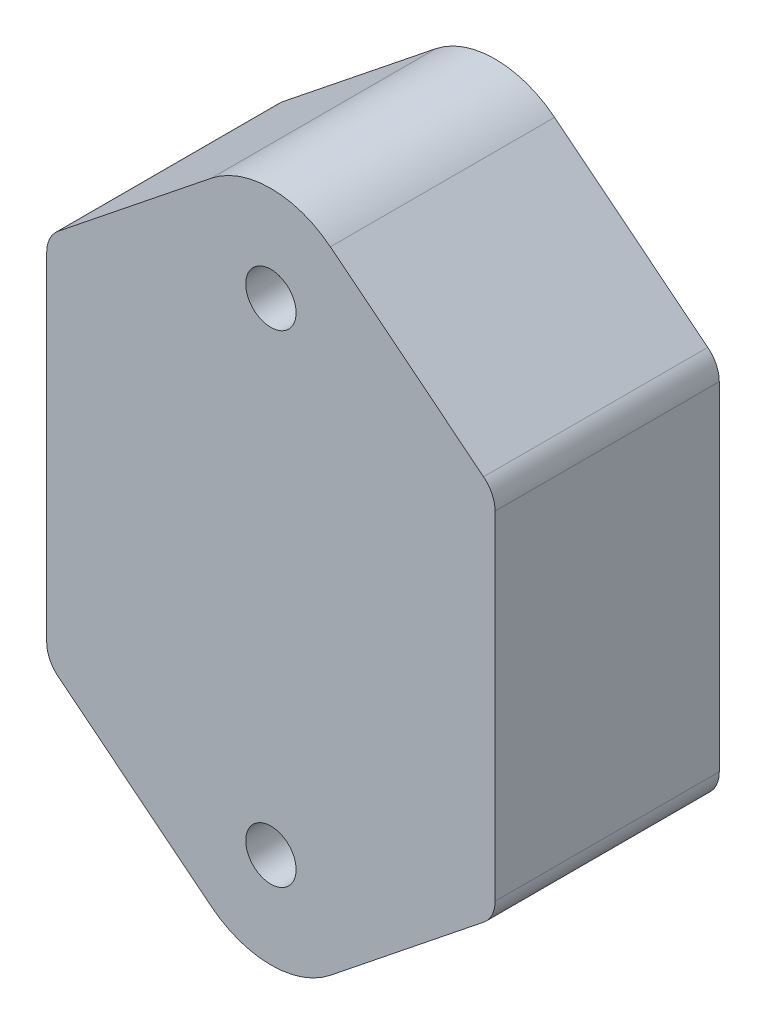
ISO-10303-21;
HEADER;
FILE_DESCRIPTION(('STEP AP214'),'2;1');
FILE_NAME('part.step','',(''),(''),'','','');
FILE_SCHEMA(('AUTOMOTIVE_DESIGN { 1 0 10303 214 1 1 1 1 }'));
ENDSEC;
DATA;
#1=APPLICATION_CONTEXT('core data for automotive mechanical design processes');
#2=APPLICATION_PROTOCOL_DEFINITION('international standard','automotive_design',2000,#1);
#3=PRODUCT_CONTEXT('',#1,'mechanical');
#4=PRODUCT('Part','Part','',(#3));
#5=PRODUCT_RELATED_PRODUCT_CATEGORY('part','',(#4));
#6=PRODUCT_DEFINITION_FORMATION('','',#4);
#7=PRODUCT_DEFINITION_CONTEXT('part definition',#1,'design');
#8=PRODUCT_DEFINITION('design','',#6,#7);
#9=PRODUCT_DEFINITION_SHAPE('','',#8);
#10=(LENGTH_UNIT() NAMED_UNIT(*) SI_UNIT(.MILLI.,.METRE.));
#11=(NAMED_UNIT(*) PLANE_ANGLE_UNIT() SI_UNIT($,.RADIAN.));
#12=(NAMED_UNIT(*) SI_UNIT($,.STERADIAN.) SOLID_ANGLE_UNIT());
#13=UNCERTAINTY_MEASURE_WITH_UNIT(LENGTH_MEASURE(1.E-05),#10,'distance_accuracy_value','');
#14=(GEOMETRIC_REPRESENTATION_CONTEXT(3) GLOBAL_UNCERTAINTY_ASSIGNED_CONTEXT((#13)) GLOBAL_UNIT_ASSIGNED_CONTEXT((#10,
#11,#12)) REPRESENTATION_CONTEXT('',''));
#15=CARTESIAN_POINT('',(0.,0.,0.));
#16=DIRECTION('',(0.,0.,1.));
#17=DIRECTION('',(1.,0.,0.));
#18=AXIS2_PLACEMENT_3D('',#15,#16,#17);
#19=CARTESIAN_POINT('',(16.002,33.909,18.542));
#20=DIRECTION('',(0.,0.,-1.));
#21=DIRECTION('',(-1.,0.,0.));
#22=AXIS2_PLACEMENT_3D('',#19,#20,#21);
#23=PLANE('',#22);
#24=CARTESIAN_POINT('',(16.002,33.909,18.542));
#25=DIRECTION('',(0.,0.,1.));
#26=DIRECTION('',(-1.,0.,0.));
#27=AXIS2_PLACEMENT_3D('',#24,#25,#26);
#28=CIRCLE('',#27,7.874);
#29=CARTESIAN_POINT('',(20.9203317887087,40.0579745824957,18.542));
#30=VERTEX_POINT('',#29);
#31=CARTESIAN_POINT('',(11.0836682112913,40.0579745824957,18.542));
#32=VERTEX_POINT('',#31);
#33=EDGE_CURVE('E176',#30,#32,#28,.T.);
#34=ORIENTED_EDGE('',*,*,#33,.T.);
#35=DIRECTION('',(-0.780921333819615,-0.624629386424777,0.));
#36=VECTOR('',#35,1.);
#37=CARTESIAN_POINT('',(-1.58655864151893,29.9235401879018,18.542));
#38=LINE('',#37,#36);
#39=CARTESIAN_POINT('',(-1.58655864151893,29.9235401879018,18.542));
#40=VERTEX_POINT('',#39);
#41=EDGE_CURVE('E104',#32,#40,#38,.T.);
#42=ORIENTED_EDGE('',*,*,#41,.T.);
#43=CARTESIAN_POINT('',(0.,27.94,18.542));
#44=DIRECTION('',(0.,0.,1.));
#45=DIRECTION('',(-1.,0.,0.));
#46=AXIS2_PLACEMENT_3D('',#43,#44,#45);
#47=CIRCLE('',#46,2.54);
#48=CARTESIAN_POINT('',(-2.54,27.94,18.542));
#49=VERTEX_POINT('',#48);
#50=EDGE_CURVE('E203',#40,#49,#47,.T.);
#51=ORIENTED_EDGE('',*,*,#50,.T.);
#52=DIRECTION('',(0.,-1.,0.));
#53=VECTOR('',#52,1.);
#54=CARTESIAN_POINT('',(-2.54,0.,18.542));
#55=LINE('',#54,#53);
#56=CARTESIAN_POINT('',(-2.54,0.,18.542));
#57=VERTEX_POINT('',#56);
#58=EDGE_CURVE('E222',#49,#57,#55,.T.);
#59=ORIENTED_EDGE('',*,*,#58,.T.);
#60=CARTESIAN_POINT('',(0.,0.,18.542));
#61=DIRECTION('',(0.,0.,1.));
#62=DIRECTION('',(1.,0.,0.));
#63=AXIS2_PLACEMENT_3D('',#60,#61,#62);
#64=CIRCLE('',#63,2.54);
#65=CARTESIAN_POINT('',(-1.58655864151893,-1.98354018790182,18.542));
#66=VERTEX_POINT('',#65);
#67=EDGE_CURVE('E219',#57,#66,#64,.T.);
#68=ORIENTED_EDGE('',*,*,#67,.T.);
#69=DIRECTION('',(0.780921333819615,-0.624629386424777,0.));
#70=VECTOR('',#69,1.);
#71=CARTESIAN_POINT('',(11.0836682112913,-12.1179745824956,18.542));
#72=LINE('',#71,#70);
#73=CARTESIAN_POINT('',(11.0836682112913,-12.1179745824956,18.542));
#74=VERTEX_POINT('',#73);
#75=EDGE_CURVE('E221',#66,#74,#72,.T.);
#76=ORIENTED_EDGE('',*,*,#75,.T.);
#77=CARTESIAN_POINT('',(16.002,-5.969,18.542));
#78=DIRECTION('',(0.,0.,1.));
#79=DIRECTION('',(-1.,0.,0.));
#80=AXIS2_PLACEMENT_3D('',#77,#78,#79);
#81=CIRCLE('',#80,7.874);
#82=CARTESIAN_POINT('',(20.9203317887087,-12.1179745824956,18.542));
#83=VERTEX_POINT('',#82);
#84=EDGE_CURVE('E224',#74,#83,#81,.T.);
#85=ORIENTED_EDGE('',*,*,#84,.T.);
#86=DIRECTION('',(0.780921333819615,0.624629386424777,0.));
#87=VECTOR('',#86,1.);
#88=CARTESIAN_POINT('',(33.5905586415189,-1.98354018790182,18.542));
#89=LINE('',#88,#87);
#90=CARTESIAN_POINT('',(33.5905586415189,-1.98354018790182,18.542));
#91=VERTEX_POINT('',#90);
#92=EDGE_CURVE('E230',#83,#91,#89,.T.);
#93=ORIENTED_EDGE('',*,*,#92,.T.);
#94=CARTESIAN_POINT('',(32.004,0.,18.542));
#95=DIRECTION('',(0.,0.,1.));
#96=DIRECTION('',(-1.,0.,0.));
#97=AXIS2_PLACEMENT_3D('',#94,#95,#96);
#98=CIRCLE('',#97,2.54);
#99=CARTESIAN_POINT('',(34.544,0.,18.542));
#100=VERTEX_POINT('',#99);
#101=EDGE_CURVE('E135',#91,#100,#98,.T.);
#102=ORIENTED_EDGE('',*,*,#101,.T.);
#103=DIRECTION('',(0.,1.,0.));
#104=VECTOR('',#103,1.);
#105=CARTESIAN_POINT('',(34.544,27.94,18.542));
#106=LINE('',#105,#104);
#107=CARTESIAN_POINT('',(34.544,27.94,18.542));
#108=VERTEX_POINT('',#107);
#109=EDGE_CURVE('E129',#100,#108,#106,.T.);
#110=ORIENTED_EDGE('',*,*,#109,.T.);
#111=CARTESIAN_POINT('',(32.004,27.94,18.542));
#112=DIRECTION('',(0.,0.,1.));
#113=DIRECTION('',(-1.,0.,0.));
#114=AXIS2_PLACEMENT_3D('',#111,#112,#113);
#115=CIRCLE('',#114,2.54);
#116=CARTESIAN_POINT('',(33.5905586415189,29.9235401879018,18.542));
#117=VERTEX_POINT('',#116);
#118=EDGE_CURVE('E133',#108,#117,#115,.T.);
#119=ORIENTED_EDGE('',*,*,#118,.T.);
#120=DIRECTION('',(-0.780921333819615,0.624629386424777,0.));
#121=VECTOR('',#120,1.);
#122=CARTESIAN_POINT('',(20.9203317887087,40.0579745824957,18.542));
#123=LINE('',#122,#121);
#124=EDGE_CURVE('E49',#117,#30,#123,.T.);
#125=ORIENTED_EDGE('',*,*,#124,.T.);
#126=EDGE_LOOP('',(#34,#42,#51,#59,#68,#76,#85,#93,#102,#110,#119,#125));
#127=FACE_BOUND('',#126,.T.);
#128=CARTESIAN_POINT('',(16.002,33.909,18.542));
#129=DIRECTION('',(0.,0.,1.));
#130=DIRECTION('',(1.,0.,0.));
#131=AXIS2_PLACEMENT_3D('',#128,#129,#130);
#132=CIRCLE('',#131,2.0828);
#133=CARTESIAN_POINT('',(18.0848,33.909,18.542));
#134=VERTEX_POINT('',#133);
#135=EDGE_CURVE('E157',#134,#134,#132,.T.);
#136=ORIENTED_EDGE('',*,*,#135,.F.);
#137=EDGE_LOOP('',(#136));
#138=FACE_BOUND('',#137,.T.);
#139=CARTESIAN_POINT('',(16.002,-5.969,18.542));
#140=DIRECTION('',(0.,0.,1.));
#141=DIRECTION('',(1.,0.,0.));
#142=AXIS2_PLACEMENT_3D('',#139,#140,#141);
#143=CIRCLE('',#142,2.0828);
#144=CARTESIAN_POINT('',(18.0848,-5.969,18.542));
#145=VERTEX_POINT('',#144);
#146=EDGE_CURVE('E271',#145,#145,#143,.T.);
#147=ORIENTED_EDGE('',*,*,#146,.F.);
#148=EDGE_LOOP('',(#147));
#149=FACE_BOUND('',#148,.T.);
#150=ADVANCED_FACE('F32',(#127,#138,#149),#23,.F.);
#151=CARTESIAN_POINT('',(16.002,33.909,0.));
#152=DIRECTION('',(0.,0.,-1.));
#153=DIRECTION('',(-1.,0.,0.));
#154=AXIS2_PLACEMENT_3D('',#151,#152,#153);
#155=PLANE('',#154);
#156=CARTESIAN_POINT('',(16.002,33.909,0.));
#157=DIRECTION('',(0.,0.,1.));
#158=DIRECTION('',(1.,0.,0.));
#159=AXIS2_PLACEMENT_3D('',#156,#157,#158);
#160=CIRCLE('',#159,2.0828);
#161=CARTESIAN_POINT('',(18.0848,33.909,0.));
#162=VERTEX_POINT('',#161);
#163=EDGE_CURVE('E276',#162,#162,#160,.T.);
#164=ORIENTED_EDGE('',*,*,#163,.T.);
#165=EDGE_LOOP('',(#164));
#166=FACE_BOUND('',#165,.T.);
#167=CARTESIAN_POINT('',(16.002,33.909,0.));
#168=DIRECTION('',(0.,0.,1.));
#169=DIRECTION('',(-1.,0.,0.));
#170=AXIS2_PLACEMENT_3D('',#167,#168,#169);
#171=CIRCLE('',#170,7.874);
#172=CARTESIAN_POINT('',(20.9203317887087,40.0579745824957,0.));
#173=VERTEX_POINT('',#172);
#174=CARTESIAN_POINT('',(11.0836682112913,40.0579745824957,0.));
#175=VERTEX_POINT('',#174);
#176=EDGE_CURVE('E153',#173,#175,#171,.T.);
#177=ORIENTED_EDGE('',*,*,#176,.F.);
#178=DIRECTION('',(-0.780921333819615,0.624629386424777,0.));
#179=VECTOR('',#178,1.);
#180=CARTESIAN_POINT('',(20.9203317887087,40.0579745824957,0.));
#181=LINE('',#180,#179);
#182=CARTESIAN_POINT('',(33.5905586415189,29.9235401879018,0.));
#183=VERTEX_POINT('',#182);
#184=EDGE_CURVE('E96',#183,#173,#181,.T.);
#185=ORIENTED_EDGE('',*,*,#184,.F.);
#186=CARTESIAN_POINT('',(32.004,27.94,0.));
#187=DIRECTION('',(0.,0.,1.));
#188=DIRECTION('',(-1.,0.,0.));
#189=AXIS2_PLACEMENT_3D('',#186,#187,#188);
#190=CIRCLE('',#189,2.54);
#191=CARTESIAN_POINT('',(34.544,27.94,0.));
#192=VERTEX_POINT('',#191);
#193=EDGE_CURVE('E90',#192,#183,#190,.T.);
#194=ORIENTED_EDGE('',*,*,#193,.F.);
#195=DIRECTION('',(0.,1.,0.));
#196=VECTOR('',#195,1.);
#197=CARTESIAN_POINT('',(34.544,27.94,0.));
#198=LINE('',#197,#196);
#199=CARTESIAN_POINT('',(34.544,0.,0.));
#200=VERTEX_POINT('',#199);
#201=EDGE_CURVE('E143',#200,#192,#198,.T.);
#202=ORIENTED_EDGE('',*,*,#201,.F.);
#203=CARTESIAN_POINT('',(32.004,0.,0.));
#204=DIRECTION('',(0.,0.,1.));
#205=DIRECTION('',(-1.,0.,0.));
#206=AXIS2_PLACEMENT_3D('',#203,#204,#205);
#207=CIRCLE('',#206,2.54);
#208=CARTESIAN_POINT('',(33.5905586415189,-1.98354018790182,0.));
#209=VERTEX_POINT('',#208);
#210=EDGE_CURVE('E171',#209,#200,#207,.T.);
#211=ORIENTED_EDGE('',*,*,#210,.F.);
#212=DIRECTION('',(0.780921333819615,0.624629386424777,0.));
#213=VECTOR('',#212,1.);
#214=CARTESIAN_POINT('',(33.5905586415189,-1.98354018790182,0.));
#215=LINE('',#214,#213);
#216=CARTESIAN_POINT('',(20.9203317887087,-12.1179745824956,0.));
#217=VERTEX_POINT('',#216);
#218=EDGE_CURVE('E169',#217,#209,#215,.T.);
#219=ORIENTED_EDGE('',*,*,#218,.F.);
#220=CARTESIAN_POINT('',(16.002,-5.969,0.));
#221=DIRECTION('',(0.,0.,1.));
#222=DIRECTION('',(-1.,0.,0.));
#223=AXIS2_PLACEMENT_3D('',#220,#221,#222);
#224=CIRCLE('',#223,7.874);
#225=CARTESIAN_POINT('',(11.0836682112913,-12.1179745824956,0.));
#226=VERTEX_POINT('',#225);
#227=EDGE_CURVE('E167',#226,#217,#224,.T.);
#228=ORIENTED_EDGE('',*,*,#227,.F.);
#229=DIRECTION('',(0.780921333819615,-0.624629386424777,0.));
#230=VECTOR('',#229,1.);
#231=CARTESIAN_POINT('',(11.0836682112913,-12.1179745824956,0.));
#232=LINE('',#231,#230);
#233=CARTESIAN_POINT('',(-1.58655864151893,-1.98354018790182,0.));
#234=VERTEX_POINT('',#233);
#235=EDGE_CURVE('E165',#234,#226,#232,.T.);
#236=ORIENTED_EDGE('',*,*,#235,.F.);
#237=CARTESIAN_POINT('',(0.,0.,0.));
#238=DIRECTION('',(0.,0.,1.));
#239=DIRECTION('',(1.,0.,0.));
#240=AXIS2_PLACEMENT_3D('',#237,#238,#239);
#241=CIRCLE('',#240,2.54);
#242=CARTESIAN_POINT('',(-2.54,0.,0.));
#243=VERTEX_POINT('',#242);
#244=EDGE_CURVE('E163',#243,#234,#241,.T.);
#245=ORIENTED_EDGE('',*,*,#244,.F.);
#246=DIRECTION('',(0.,-1.,0.));
#247=VECTOR('',#246,1.);
#248=CARTESIAN_POINT('',(-2.54,0.,0.));
#249=LINE('',#248,#247);
#250=CARTESIAN_POINT('',(-2.54,27.94,0.));
#251=VERTEX_POINT('',#250);
#252=EDGE_CURVE('E161',#251,#243,#249,.T.);
#253=ORIENTED_EDGE('',*,*,#252,.F.);
#254=CARTESIAN_POINT('',(0.,27.94,0.));
#255=DIRECTION('',(0.,0.,1.));
#256=DIRECTION('',(-1.,0.,0.));
#257=AXIS2_PLACEMENT_3D('',#254,#255,#256);
#258=CIRCLE('',#257,2.54);
#259=CARTESIAN_POINT('',(-1.58655864151893,29.9235401879018,0.));
#260=VERTEX_POINT('',#259);
#261=EDGE_CURVE('E159',#260,#251,#258,.T.);
#262=ORIENTED_EDGE('',*,*,#261,.F.);
#263=DIRECTION('',(-0.780921333819615,-0.624629386424777,0.));
#264=VECTOR('',#263,1.);
#265=CARTESIAN_POINT('',(-1.58655864151893,29.9235401879018,0.));
#266=LINE('',#265,#264);
#267=EDGE_CURVE('E156',#175,#260,#266,.T.);
#268=ORIENTED_EDGE('',*,*,#267,.F.);
#269=EDGE_LOOP('',(#177,#185,#194,#202,#211,#219,#228,#236,#245,#253,#262,#268));
#270=FACE_BOUND('',#269,.T.);
#271=CARTESIAN_POINT('',(16.002,-5.969,0.));
#272=DIRECTION('',(0.,0.,1.));
#273=DIRECTION('',(1.,0.,0.));
#274=AXIS2_PLACEMENT_3D('',#271,#272,#273);
#275=CIRCLE('',#274,2.0828);
#276=CARTESIAN_POINT('',(18.0848,-5.969,0.));
#277=VERTEX_POINT('',#276);
#278=EDGE_CURVE('E274',#277,#277,#275,.T.);
#279=ORIENTED_EDGE('',*,*,#278,.T.);
#280=EDGE_LOOP('',(#279));
#281=FACE_BOUND('',#280,.T.);
#282=ADVANCED_FACE('F207',(#166,#270,#281),#155,.T.);
#283=CARTESIAN_POINT('',(16.002,33.909,18.542));
#284=DIRECTION('',(0.,0.,-1.));
#285=DIRECTION('',(-1.,0.,0.));
#286=AXIS2_PLACEMENT_3D('',#283,#284,#285);
#287=CYLINDRICAL_SURFACE('',#286,7.874);
#288=ORIENTED_EDGE('',*,*,#176,.T.);
#289=DIRECTION('',(0.,0.,-1.));
#290=VECTOR('',#289,1.);
#291=CARTESIAN_POINT('',(11.0836682112913,40.0579745824957,18.542));
#292=LINE('',#291,#290);
#293=EDGE_CURVE('E11',#32,#175,#292,.T.);
#294=ORIENTED_EDGE('',*,*,#293,.F.);
#295=ORIENTED_EDGE('',*,*,#33,.F.);
#296=DIRECTION('',(0.,0.,-1.));
#297=VECTOR('',#296,1.);
#298=CARTESIAN_POINT('',(20.9203317887087,40.0579745824957,18.542));
#299=LINE('',#298,#297);
#300=EDGE_CURVE('E149',#30,#173,#299,.T.);
#301=ORIENTED_EDGE('',*,*,#300,.T.);
#302=EDGE_LOOP('',(#288,#294,#295,#301));
#303=FACE_BOUND('',#302,.T.);
#304=ADVANCED_FACE('F34',(#303),#287,.T.);
#305=CARTESIAN_POINT('',(-1.58655864151893,29.9235401879018,18.542));
#306=DIRECTION('',(0.624629386424777,-0.780921333819615,0.));
#307=DIRECTION('',(0.780921333819615,0.624629386424777,0.));
#308=AXIS2_PLACEMENT_3D('',#305,#306,#307);
#309=PLANE('',#308);
#310=ORIENTED_EDGE('',*,*,#267,.T.);
#311=DIRECTION('',(0.,0.,-1.));
#312=VECTOR('',#311,1.);
#313=CARTESIAN_POINT('',(-1.58655864151893,29.9235401879018,18.542));
#314=LINE('',#313,#312);
#315=EDGE_CURVE('E41',#40,#260,#314,.T.);
#316=ORIENTED_EDGE('',*,*,#315,.F.);
#317=ORIENTED_EDGE('',*,*,#41,.F.);
#318=ORIENTED_EDGE('',*,*,#293,.T.);
#319=EDGE_LOOP('',(#310,#316,#317,#318));
#320=FACE_BOUND('',#319,.T.);
#321=ADVANCED_FACE('F371',(#320),#309,.F.);
#322=CARTESIAN_POINT('',(0.,27.94,18.542));
#323=DIRECTION('',(0.,0.,-1.));
#324=DIRECTION('',(-1.,0.,0.));
#325=AXIS2_PLACEMENT_3D('',#322,#323,#324);
#326=CYLINDRICAL_SURFACE('',#325,2.54);
#327=ORIENTED_EDGE('',*,*,#261,.T.);
#328=DIRECTION('',(0.,0.,-1.));
#329=VECTOR('',#328,1.);
#330=CARTESIAN_POINT('',(-2.54,27.94,18.542));
#331=LINE('',#330,#329);
#332=EDGE_CURVE('E195',#49,#251,#331,.T.);
#333=ORIENTED_EDGE('',*,*,#332,.F.);
#334=ORIENTED_EDGE('',*,*,#50,.F.);
#335=ORIENTED_EDGE('',*,*,#315,.T.);
#336=EDGE_LOOP('',(#327,#333,#334,#335));
#337=FACE_BOUND('',#336,.T.);
#338=ADVANCED_FACE('F201',(#337),#326,.T.);
#339=CARTESIAN_POINT('',(-2.54,0.,18.542));
#340=DIRECTION('',(1.,0.,0.));
#341=DIRECTION('',(0.,1.,0.));
#342=AXIS2_PLACEMENT_3D('',#339,#340,#341);
#343=PLANE('',#342);
#344=ORIENTED_EDGE('',*,*,#252,.T.);
#345=DIRECTION('',(0.,0.,-1.));
#346=VECTOR('',#345,1.);
#347=CARTESIAN_POINT('',(-2.54,0.,18.542));
#348=LINE('',#347,#346);
#349=EDGE_CURVE('E192',#57,#243,#348,.T.);
#350=ORIENTED_EDGE('',*,*,#349,.F.);
#351=ORIENTED_EDGE('',*,*,#58,.F.);
#352=ORIENTED_EDGE('',*,*,#332,.T.);
#353=EDGE_LOOP('',(#344,#350,#351,#352));
#354=FACE_BOUND('',#353,.T.);
#355=ADVANCED_FACE('F213',(#354),#343,.F.);
#356=CARTESIAN_POINT('',(0.,0.,18.542));
#357=DIRECTION('',(0.,0.,-1.));
#358=DIRECTION('',(-1.,0.,0.));
#359=AXIS2_PLACEMENT_3D('',#356,#357,#358);
#360=CYLINDRICAL_SURFACE('',#359,2.54);
#361=ORIENTED_EDGE('',*,*,#244,.T.);
#362=DIRECTION('',(0.,0.,-1.));
#363=VECTOR('',#362,1.);
#364=CARTESIAN_POINT('',(-1.58655864151893,-1.98354018790182,18.542));
#365=LINE('',#364,#363);
#366=EDGE_CURVE('E189',#66,#234,#365,.T.);
#367=ORIENTED_EDGE('',*,*,#366,.F.);
#368=ORIENTED_EDGE('',*,*,#67,.F.);
#369=ORIENTED_EDGE('',*,*,#349,.T.);
#370=EDGE_LOOP('',(#361,#367,#368,#369));
#371=FACE_BOUND('',#370,.T.);
#372=ADVANCED_FACE('F217',(#371),#360,.T.);
#373=CARTESIAN_POINT('',(11.0836682112913,-12.1179745824956,18.542));
#374=DIRECTION('',(0.624629386424777,0.780921333819615,0.));
#375=DIRECTION('',(-0.780921333819615,0.624629386424777,0.));
#376=AXIS2_PLACEMENT_3D('',#373,#374,#375);
#377=PLANE('',#376);
#378=ORIENTED_EDGE('',*,*,#235,.T.);
#379=DIRECTION('',(0.,0.,-1.));
#380=VECTOR('',#379,1.);
#381=CARTESIAN_POINT('',(11.0836682112913,-12.1179745824956,18.542));
#382=LINE('',#381,#380);
#383=EDGE_CURVE('E186',#74,#226,#382,.T.);
#384=ORIENTED_EDGE('',*,*,#383,.F.);
#385=ORIENTED_EDGE('',*,*,#75,.F.);
#386=ORIENTED_EDGE('',*,*,#366,.T.);
#387=EDGE_LOOP('',(#378,#384,#385,#386));
#388=FACE_BOUND('',#387,.T.);
#389=ADVANCED_FACE('F336',(#388),#377,.F.);
#390=CARTESIAN_POINT('',(16.002,-5.969,18.542));
#391=DIRECTION('',(0.,0.,-1.));
#392=DIRECTION('',(-1.,0.,0.));
#393=AXIS2_PLACEMENT_3D('',#390,#391,#392);
#394=CYLINDRICAL_SURFACE('',#393,7.874);
#395=ORIENTED_EDGE('',*,*,#227,.T.);
#396=DIRECTION('',(0.,0.,-1.));
#397=VECTOR('',#396,1.);
#398=CARTESIAN_POINT('',(20.9203317887087,-12.1179745824956,18.542));
#399=LINE('',#398,#397);
#400=EDGE_CURVE('E183',#83,#217,#399,.T.);
#401=ORIENTED_EDGE('',*,*,#400,.F.);
#402=ORIENTED_EDGE('',*,*,#84,.F.);
#403=ORIENTED_EDGE('',*,*,#383,.T.);
#404=EDGE_LOOP('',(#395,#401,#402,#403));
#405=FACE_BOUND('',#404,.T.);
#406=ADVANCED_FACE('F327',(#405),#394,.T.);
#407=CARTESIAN_POINT('',(33.5905586415189,-1.98354018790182,18.542));
#408=DIRECTION('',(-0.624629386424777,0.780921333819615,0.));
#409=DIRECTION('',(-0.780921333819615,-0.624629386424777,0.));
#410=AXIS2_PLACEMENT_3D('',#407,#408,#409);
#411=PLANE('',#410);
#412=ORIENTED_EDGE('',*,*,#218,.T.);
#413=DIRECTION('',(0.,0.,-1.));
#414=VECTOR('',#413,1.);
#415=CARTESIAN_POINT('',(33.5905586415189,-1.98354018790182,18.542));
#416=LINE('',#415,#414);
#417=EDGE_CURVE('E180',#91,#209,#416,.T.);
#418=ORIENTED_EDGE('',*,*,#417,.F.);
#419=ORIENTED_EDGE('',*,*,#92,.F.);
#420=ORIENTED_EDGE('',*,*,#400,.T.);
#421=EDGE_LOOP('',(#412,#418,#419,#420));
#422=FACE_BOUND('',#421,.T.);
#423=ADVANCED_FACE('F236',(#422),#411,.F.);
#424=CARTESIAN_POINT('',(32.004,0.,18.542));
#425=DIRECTION('',(0.,0.,-1.));
#426=DIRECTION('',(-1.,0.,0.));
#427=AXIS2_PLACEMENT_3D('',#424,#425,#426);
#428=CYLINDRICAL_SURFACE('',#427,2.54);
#429=ORIENTED_EDGE('',*,*,#210,.T.);
#430=DIRECTION('',(0.,0.,-1.));
#431=VECTOR('',#430,1.);
#432=CARTESIAN_POINT('',(34.544,0.,18.542));
#433=LINE('',#432,#431);
#434=EDGE_CURVE('E144',#100,#200,#433,.T.);
#435=ORIENTED_EDGE('',*,*,#434,.F.);
#436=ORIENTED_EDGE('',*,*,#101,.F.);
#437=ORIENTED_EDGE('',*,*,#417,.T.);
#438=EDGE_LOOP('',(#429,#435,#436,#437));
#439=FACE_BOUND('',#438,.T.);
#440=ADVANCED_FACE('F240',(#439),#428,.T.);
#441=CARTESIAN_POINT('',(34.544,27.94,18.542));
#442=DIRECTION('',(-1.,0.,0.));
#443=DIRECTION('',(0.,-1.,0.));
#444=AXIS2_PLACEMENT_3D('',#441,#442,#443);
#445=PLANE('',#444);
#446=ORIENTED_EDGE('',*,*,#201,.T.);
#447=DIRECTION('',(0.,0.,-1.));
#448=VECTOR('',#447,1.);
#449=CARTESIAN_POINT('',(34.544,27.94,18.542));
#450=LINE('',#449,#448);
#451=EDGE_CURVE('E140',#108,#192,#450,.T.);
#452=ORIENTED_EDGE('',*,*,#451,.F.);
#453=ORIENTED_EDGE('',*,*,#109,.F.);
#454=ORIENTED_EDGE('',*,*,#434,.T.);
#455=EDGE_LOOP('',(#446,#452,#453,#454));
#456=FACE_BOUND('',#455,.T.);
#457=ADVANCED_FACE('F141',(#456),#445,.F.);
#458=CARTESIAN_POINT('',(32.004,27.94,18.542));
#459=DIRECTION('',(0.,0.,-1.));
#460=DIRECTION('',(-1.,0.,0.));
#461=AXIS2_PLACEMENT_3D('',#458,#459,#460);
#462=CYLINDRICAL_SURFACE('',#461,2.54);
#463=ORIENTED_EDGE('',*,*,#193,.T.);
#464=DIRECTION('',(0.,0.,-1.));
#465=VECTOR('',#464,1.);
#466=CARTESIAN_POINT('',(33.5905586415189,29.9235401879018,18.542));
#467=LINE('',#466,#465);
#468=EDGE_CURVE('E145',#117,#183,#467,.T.);
#469=ORIENTED_EDGE('',*,*,#468,.F.);
#470=ORIENTED_EDGE('',*,*,#118,.F.);
#471=ORIENTED_EDGE('',*,*,#451,.T.);
#472=EDGE_LOOP('',(#463,#469,#470,#471));
#473=FACE_BOUND('',#472,.T.);
#474=ADVANCED_FACE('F147',(#473),#462,.T.);
#475=CARTESIAN_POINT('',(20.9203317887087,40.0579745824957,18.542));
#476=DIRECTION('',(-0.624629386424777,-0.780921333819615,0.));
#477=DIRECTION('',(0.780921333819615,-0.624629386424777,0.));
#478=AXIS2_PLACEMENT_3D('',#475,#476,#477);
#479=PLANE('',#478);
#480=ORIENTED_EDGE('',*,*,#184,.T.);
#481=ORIENTED_EDGE('',*,*,#300,.F.);
#482=ORIENTED_EDGE('',*,*,#124,.F.);
#483=ORIENTED_EDGE('',*,*,#468,.T.);
#484=EDGE_LOOP('',(#480,#481,#482,#483));
#485=FACE_BOUND('',#484,.T.);
#486=ADVANCED_FACE('F244',(#485),#479,.F.);
#487=CARTESIAN_POINT('',(16.002,33.909,18.542));
#488=DIRECTION('',(0.,0.,-1.));
#489=DIRECTION('',(-1.,0.,0.));
#490=AXIS2_PLACEMENT_3D('',#487,#488,#489);
#491=CYLINDRICAL_SURFACE('',#490,2.0828);
#492=ORIENTED_EDGE('',*,*,#135,.T.);
#493=EDGE_LOOP('',(#492));
#494=FACE_BOUND('',#493,.T.);
#495=ORIENTED_EDGE('',*,*,#163,.F.);
#496=EDGE_LOOP('',(#495));
#497=FACE_BOUND('',#496,.T.);
#498=ADVANCED_FACE('F246',(#494,#497),#491,.F.);
#499=CARTESIAN_POINT('',(16.002,-5.969,18.542));
#500=DIRECTION('',(0.,0.,-1.));
#501=DIRECTION('',(-1.,0.,0.));
#502=AXIS2_PLACEMENT_3D('',#499,#500,#501);
#503=CYLINDRICAL_SURFACE('',#502,2.0828);
#504=ORIENTED_EDGE('',*,*,#146,.T.);
#505=EDGE_LOOP('',(#504));
#506=FACE_BOUND('',#505,.T.);
#507=ORIENTED_EDGE('',*,*,#278,.F.);
#508=EDGE_LOOP('',(#507));
#509=FACE_BOUND('',#508,.T.);
#510=ADVANCED_FACE('F252',(#506,#509),#503,.F.);
#511=CLOSED_SHELL('',(#150,#282,#304,#321,#338,#355,#372,#389,#406,#423,#440,#457,#474,#486,
#498,#510));
#512=MANIFOLD_SOLID_BREP('B2',#511);
#513=ADVANCED_BREP_SHAPE_REPRESENTATION('',(#18,#512),#14);
#514=SHAPE_DEFINITION_REPRESENTATION(#9,#513);
ENDSEC;
END-ISO-10303-21;
